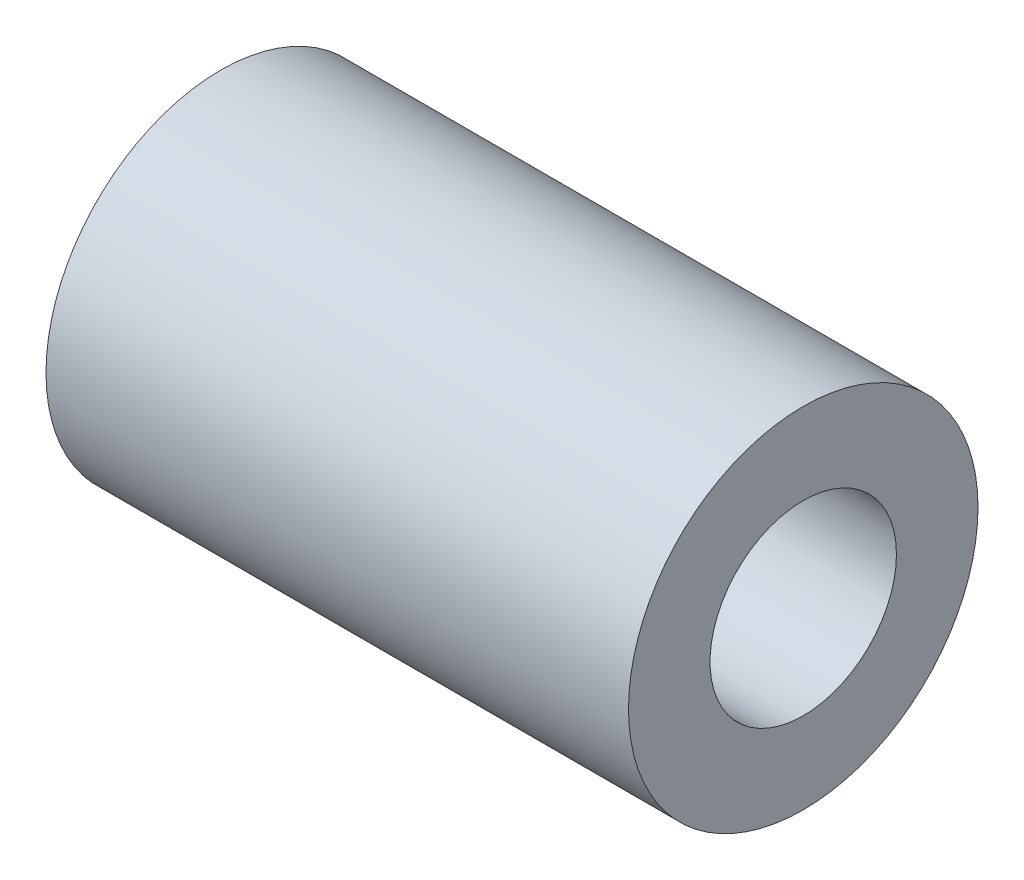
ISO-10303-21;
HEADER;
FILE_DESCRIPTION(('STEP AP214'),'2;1');
FILE_NAME('part.step','',(''),(''),'','','');
FILE_SCHEMA(('AUTOMOTIVE_DESIGN { 1 0 10303 214 1 1 1 1 }'));
ENDSEC;
DATA;
#1=APPLICATION_CONTEXT('core data for automotive mechanical design processes');
#2=APPLICATION_PROTOCOL_DEFINITION('international standard','automotive_design',2000,#1);
#3=PRODUCT_CONTEXT('',#1,'mechanical');
#4=PRODUCT('Part','Part','',(#3));
#5=PRODUCT_RELATED_PRODUCT_CATEGORY('part','',(#4));
#6=PRODUCT_DEFINITION_FORMATION('','',#4);
#7=PRODUCT_DEFINITION_CONTEXT('part definition',#1,'design');
#8=PRODUCT_DEFINITION('design','',#6,#7);
#9=PRODUCT_DEFINITION_SHAPE('','',#8);
#10=(LENGTH_UNIT() NAMED_UNIT(*) SI_UNIT(.MILLI.,.METRE.));
#11=(NAMED_UNIT(*) PLANE_ANGLE_UNIT() SI_UNIT($,.RADIAN.));
#12=(NAMED_UNIT(*) SI_UNIT($,.STERADIAN.) SOLID_ANGLE_UNIT());
#13=UNCERTAINTY_MEASURE_WITH_UNIT(LENGTH_MEASURE(1.E-05),#10,'distance_accuracy_value','');
#14=(GEOMETRIC_REPRESENTATION_CONTEXT(3) GLOBAL_UNCERTAINTY_ASSIGNED_CONTEXT((#13)) GLOBAL_UNIT_ASSIGNED_CONTEXT((#10,
#11,#12)) REPRESENTATION_CONTEXT('',''));
#15=CARTESIAN_POINT('',(0.,0.,0.));
#16=DIRECTION('',(0.,0.,1.));
#17=DIRECTION('',(1.,0.,0.));
#18=AXIS2_PLACEMENT_3D('',#15,#16,#17);
#19=CARTESIAN_POINT('',(25.,0.,0.));
#20=DIRECTION('',(-1.,0.,0.));
#21=DIRECTION('',(0.,0.,1.));
#22=AXIS2_PLACEMENT_3D('',#19,#20,#21);
#23=CYLINDRICAL_SURFACE('',#22,7.5);
#24=CARTESIAN_POINT('',(25.,0.,0.));
#25=DIRECTION('',(1.,0.,0.));
#26=DIRECTION('',(0.,0.,-1.));
#27=AXIS2_PLACEMENT_3D('',#24,#25,#26);
#28=CIRCLE('',#27,7.5);
#29=CARTESIAN_POINT('',(25.,0.,-7.5));
#30=VERTEX_POINT('',#29);
#31=EDGE_CURVE('E10',#30,#30,#28,.T.);
#32=ORIENTED_EDGE('',*,*,#31,.F.);
#33=EDGE_LOOP('',(#32));
#34=FACE_BOUND('',#33,.T.);
#35=CARTESIAN_POINT('',(0.,0.,0.));
#36=DIRECTION('',(1.,0.,0.));
#37=DIRECTION('',(0.,0.,-1.));
#38=AXIS2_PLACEMENT_3D('',#35,#36,#37);
#39=CIRCLE('',#38,7.5);
#40=CARTESIAN_POINT('',(0.,0.,-7.5));
#41=VERTEX_POINT('',#40);
#42=EDGE_CURVE('E35',#41,#41,#39,.T.);
#43=ORIENTED_EDGE('',*,*,#42,.T.);
#44=EDGE_LOOP('',(#43));
#45=FACE_BOUND('',#44,.T.);
#46=ADVANCED_FACE('F32',(#34,#45),#23,.T.);
#47=CARTESIAN_POINT('',(25.,0.,0.));
#48=DIRECTION('',(1.,0.,0.));
#49=DIRECTION('',(0.,0.,-1.));
#50=AXIS2_PLACEMENT_3D('',#47,#48,#49);
#51=PLANE('',#50);
#52=CARTESIAN_POINT('',(25.,0.,0.));
#53=DIRECTION('',(1.,0.,0.));
#54=DIRECTION('',(0.,0.,-1.));
#55=AXIS2_PLACEMENT_3D('',#52,#53,#54);
#56=CIRCLE('',#55,4.);
#57=CARTESIAN_POINT('',(25.,0.,-4.));
#58=VERTEX_POINT('',#57);
#59=EDGE_CURVE('E50',#58,#58,#56,.T.);
#60=ORIENTED_EDGE('',*,*,#59,.F.);
#61=EDGE_LOOP('',(#60));
#62=FACE_BOUND('',#61,.T.);
#63=ORIENTED_EDGE('',*,*,#31,.T.);
#64=EDGE_LOOP('',(#63));
#65=FACE_BOUND('',#64,.T.);
#66=ADVANCED_FACE('F65',(#62,#65),#51,.T.);
#67=CARTESIAN_POINT('',(0.,0.,0.));
#68=DIRECTION('',(1.,0.,0.));
#69=DIRECTION('',(0.,0.,-1.));
#70=AXIS2_PLACEMENT_3D('',#67,#68,#69);
#71=PLANE('',#70);
#72=CARTESIAN_POINT('',(0.,0.,0.));
#73=DIRECTION('',(-1.,0.,0.));
#74=DIRECTION('',(0.,0.,1.));
#75=AXIS2_PLACEMENT_3D('',#72,#73,#74);
#76=CIRCLE('',#75,2.5);
#77=CARTESIAN_POINT('',(0.,0.,2.5));
#78=VERTEX_POINT('',#77);
#79=EDGE_CURVE('E42',#78,#78,#76,.T.);
#80=ORIENTED_EDGE('',*,*,#79,.F.);
#81=EDGE_LOOP('',(#80));
#82=FACE_BOUND('',#81,.T.);
#83=ORIENTED_EDGE('',*,*,#42,.F.);
#84=EDGE_LOOP('',(#83));
#85=FACE_BOUND('',#84,.T.);
#86=ADVANCED_FACE('F67',(#82,#85),#71,.F.);
#87=CARTESIAN_POINT('',(12.5,0.,0.));
#88=DIRECTION('',(-1.,0.,0.));
#89=DIRECTION('',(0.,0.,1.));
#90=AXIS2_PLACEMENT_3D('',#87,#88,#89);
#91=CYLINDRICAL_SURFACE('',#90,2.5);
#92=CARTESIAN_POINT('',(12.5,0.,0.));
#93=DIRECTION('',(1.,0.,0.));
#94=DIRECTION('',(0.,0.,-1.));
#95=AXIS2_PLACEMENT_3D('',#92,#93,#94);
#96=CIRCLE('',#95,2.5);
#97=CARTESIAN_POINT('',(12.5,0.,-2.5));
#98=VERTEX_POINT('',#97);
#99=EDGE_CURVE('E46',#98,#98,#96,.F.);
#100=ORIENTED_EDGE('',*,*,#99,.F.);
#101=EDGE_LOOP('',(#100));
#102=FACE_BOUND('',#101,.T.);
#103=ORIENTED_EDGE('',*,*,#79,.T.);
#104=EDGE_LOOP('',(#103));
#105=FACE_BOUND('',#104,.T.);
#106=ADVANCED_FACE('F73',(#102,#105),#91,.F.);
#107=CARTESIAN_POINT('',(12.5,0.,0.));
#108=DIRECTION('',(1.,0.,0.));
#109=DIRECTION('',(0.,0.,-1.));
#110=AXIS2_PLACEMENT_3D('',#107,#108,#109);
#111=PLANE('',#110);
#112=CARTESIAN_POINT('',(12.5,0.,0.));
#113=DIRECTION('',(1.,0.,0.));
#114=DIRECTION('',(0.,0.,-1.));
#115=AXIS2_PLACEMENT_3D('',#112,#113,#114);
#116=CIRCLE('',#115,4.);
#117=CARTESIAN_POINT('',(12.5,0.,-4.));
#118=VERTEX_POINT('',#117);
#119=EDGE_CURVE('E49',#118,#118,#116,.T.);
#120=ORIENTED_EDGE('',*,*,#119,.T.);
#121=EDGE_LOOP('',(#120));
#122=FACE_BOUND('',#121,.T.);
#123=ORIENTED_EDGE('',*,*,#99,.T.);
#124=EDGE_LOOP('',(#123));
#125=FACE_BOUND('',#124,.T.);
#126=ADVANCED_FACE('F56',(#122,#125),#111,.T.);
#127=CARTESIAN_POINT('',(12.5,0.,0.));
#128=DIRECTION('',(1.,0.,0.));
#129=DIRECTION('',(0.,0.,-1.));
#130=AXIS2_PLACEMENT_3D('',#127,#128,#129);
#131=CYLINDRICAL_SURFACE('',#130,4.);
#132=ORIENTED_EDGE('',*,*,#119,.F.);
#133=EDGE_LOOP('',(#132));
#134=FACE_BOUND('',#133,.T.);
#135=ORIENTED_EDGE('',*,*,#59,.T.);
#136=EDGE_LOOP('',(#135));
#137=FACE_BOUND('',#136,.T.);
#138=ADVANCED_FACE('F59',(#134,#137),#131,.F.);
#139=CLOSED_SHELL('',(#46,#66,#86,#106,#126,#138));
#140=MANIFOLD_SOLID_BREP('B2',#139);
#141=ADVANCED_BREP_SHAPE_REPRESENTATION('',(#18,#140),#14);
#142=SHAPE_DEFINITION_REPRESENTATION(#9,#141);
ENDSEC;
END-ISO-10303-21;
